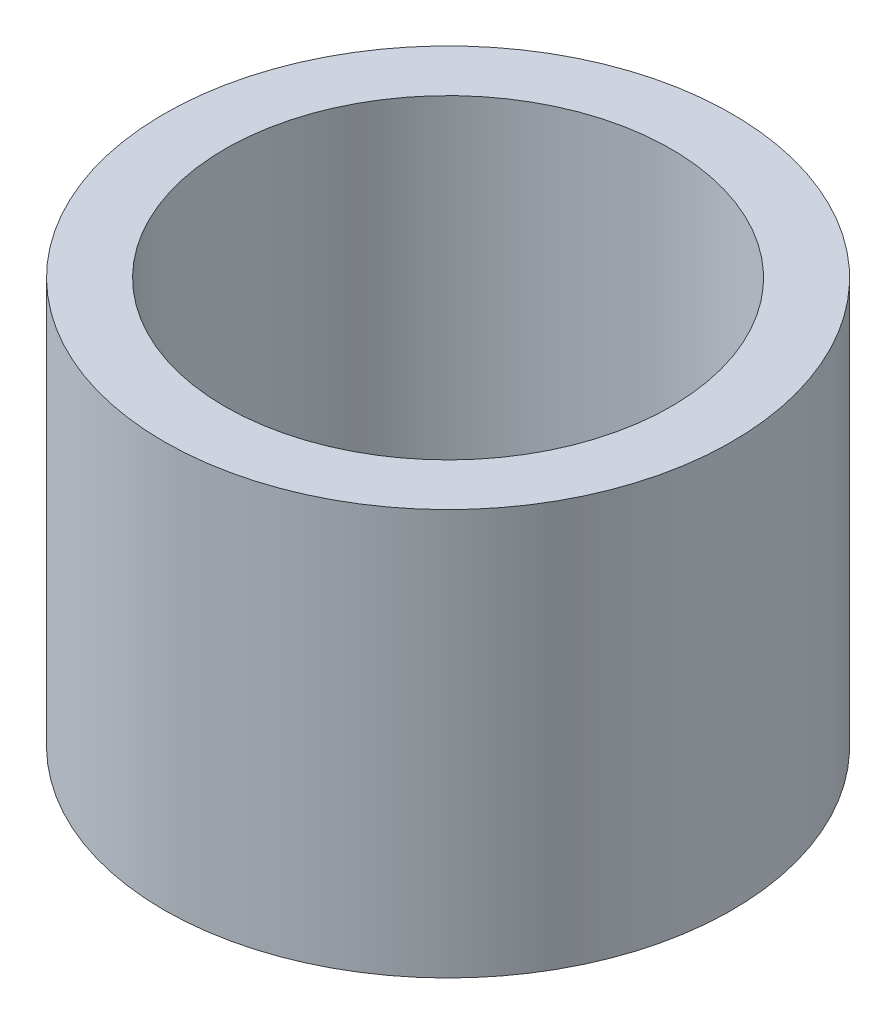
ISO-10303-21;
HEADER;
FILE_DESCRIPTION(('STEP AP214'),'2;1');
FILE_NAME('part.step','',(''),(''),'','','');
FILE_SCHEMA(('AUTOMOTIVE_DESIGN { 1 0 10303 214 1 1 1 1 }'));
ENDSEC;
DATA;
#1=APPLICATION_CONTEXT('core data for automotive mechanical design processes');
#2=APPLICATION_PROTOCOL_DEFINITION('international standard','automotive_design',2000,#1);
#3=PRODUCT_CONTEXT('',#1,'mechanical');
#4=PRODUCT('Part','Part','',(#3));
#5=PRODUCT_RELATED_PRODUCT_CATEGORY('part','',(#4));
#6=PRODUCT_DEFINITION_FORMATION('','',#4);
#7=PRODUCT_DEFINITION_CONTEXT('part definition',#1,'design');
#8=PRODUCT_DEFINITION('design','',#6,#7);
#9=PRODUCT_DEFINITION_SHAPE('','',#8);
#10=(LENGTH_UNIT() NAMED_UNIT(*) SI_UNIT(.MILLI.,.METRE.));
#11=(NAMED_UNIT(*) PLANE_ANGLE_UNIT() SI_UNIT($,.RADIAN.));
#12=(NAMED_UNIT(*) SI_UNIT($,.STERADIAN.) SOLID_ANGLE_UNIT());
#13=UNCERTAINTY_MEASURE_WITH_UNIT(LENGTH_MEASURE(1.E-05),#10,'distance_accuracy_value','');
#14=(GEOMETRIC_REPRESENTATION_CONTEXT(3) GLOBAL_UNCERTAINTY_ASSIGNED_CONTEXT((#13)) GLOBAL_UNIT_ASSIGNED_CONTEXT((#10,
#11,#12)) REPRESENTATION_CONTEXT('',''));
#15=CARTESIAN_POINT('',(0.,0.,0.));
#16=DIRECTION('',(0.,0.,1.));
#17=DIRECTION('',(1.,0.,0.));
#18=AXIS2_PLACEMENT_3D('',#15,#16,#17);
#19=CARTESIAN_POINT('',(0.,10.,0.));
#20=DIRECTION('',(0.,1.,0.));
#21=DIRECTION('',(0.,0.,1.));
#22=AXIS2_PLACEMENT_3D('',#19,#20,#21);
#23=PLANE('',#22);
#24=CARTESIAN_POINT('',(0.,10.,0.));
#25=DIRECTION('',(0.,1.,0.));
#26=DIRECTION('',(0.,0.,1.));
#27=AXIS2_PLACEMENT_3D('',#24,#25,#26);
#28=CIRCLE('',#27,7.);
#29=CARTESIAN_POINT('',(0.,10.,7.));
#30=VERTEX_POINT('',#29);
#31=EDGE_CURVE('E10',#30,#30,#28,.T.);
#32=ORIENTED_EDGE('',*,*,#31,.T.);
#33=EDGE_LOOP('',(#32));
#34=FACE_BOUND('',#33,.T.);
#35=CARTESIAN_POINT('',(0.,10.,0.));
#36=DIRECTION('',(0.,1.,0.));
#37=DIRECTION('',(0.,0.,1.));
#38=AXIS2_PLACEMENT_3D('',#35,#36,#37);
#39=CIRCLE('',#38,5.5);
#40=CARTESIAN_POINT('',(0.,10.,5.5));
#41=VERTEX_POINT('',#40);
#42=EDGE_CURVE('E50',#41,#41,#39,.T.);
#43=ORIENTED_EDGE('',*,*,#42,.F.);
#44=EDGE_LOOP('',(#43));
#45=FACE_BOUND('',#44,.T.);
#46=ADVANCED_FACE('F37',(#34,#45),#23,.T.);
#47=CARTESIAN_POINT('',(0.,0.,0.));
#48=DIRECTION('',(0.,1.,0.));
#49=DIRECTION('',(0.,0.,1.));
#50=AXIS2_PLACEMENT_3D('',#47,#48,#49);
#51=PLANE('',#50);
#52=CARTESIAN_POINT('',(0.,0.,0.));
#53=DIRECTION('',(0.,1.,0.));
#54=DIRECTION('',(0.,0.,1.));
#55=AXIS2_PLACEMENT_3D('',#52,#53,#54);
#56=CIRCLE('',#55,7.);
#57=CARTESIAN_POINT('',(0.,0.,7.));
#58=VERTEX_POINT('',#57);
#59=EDGE_CURVE('E41',#58,#58,#56,.T.);
#60=ORIENTED_EDGE('',*,*,#59,.F.);
#61=EDGE_LOOP('',(#60));
#62=FACE_BOUND('',#61,.T.);
#63=CARTESIAN_POINT('',(0.,0.,0.));
#64=DIRECTION('',(0.,1.,0.));
#65=DIRECTION('',(0.,0.,1.));
#66=AXIS2_PLACEMENT_3D('',#63,#64,#65);
#67=CIRCLE('',#66,5.5);
#68=CARTESIAN_POINT('',(0.,0.,5.5));
#69=VERTEX_POINT('',#68);
#70=EDGE_CURVE('E52',#69,#69,#67,.T.);
#71=ORIENTED_EDGE('',*,*,#70,.T.);
#72=EDGE_LOOP('',(#71));
#73=FACE_BOUND('',#72,.T.);
#74=ADVANCED_FACE('F64',(#62,#73),#51,.F.);
#75=CARTESIAN_POINT('',(0.,10.,0.));
#76=DIRECTION('',(0.,-1.,0.));
#77=DIRECTION('',(0.,0.,-1.));
#78=AXIS2_PLACEMENT_3D('',#75,#76,#77);
#79=CYLINDRICAL_SURFACE('',#78,7.);
#80=ORIENTED_EDGE('',*,*,#31,.F.);
#81=EDGE_LOOP('',(#80));
#82=FACE_BOUND('',#81,.T.);
#83=ORIENTED_EDGE('',*,*,#59,.T.);
#84=EDGE_LOOP('',(#83));
#85=FACE_BOUND('',#84,.T.);
#86=ADVANCED_FACE('F39',(#82,#85),#79,.T.);
#87=CARTESIAN_POINT('',(0.,10.,0.));
#88=DIRECTION('',(0.,-1.,0.));
#89=DIRECTION('',(0.,0.,-1.));
#90=AXIS2_PLACEMENT_3D('',#87,#88,#89);
#91=CYLINDRICAL_SURFACE('',#90,5.5);
#92=ORIENTED_EDGE('',*,*,#42,.T.);
#93=EDGE_LOOP('',(#92));
#94=FACE_BOUND('',#93,.T.);
#95=ORIENTED_EDGE('',*,*,#70,.F.);
#96=EDGE_LOOP('',(#95));
#97=FACE_BOUND('',#96,.T.);
#98=ADVANCED_FACE('F60',(#94,#97),#91,.F.);
#99=CLOSED_SHELL('',(#46,#74,#86,#98));
#100=MANIFOLD_SOLID_BREP('B2',#99);
#101=ADVANCED_BREP_SHAPE_REPRESENTATION('',(#18,#100),#14);
#102=SHAPE_DEFINITION_REPRESENTATION(#9,#101);
ENDSEC;
END-ISO-10303-21;
